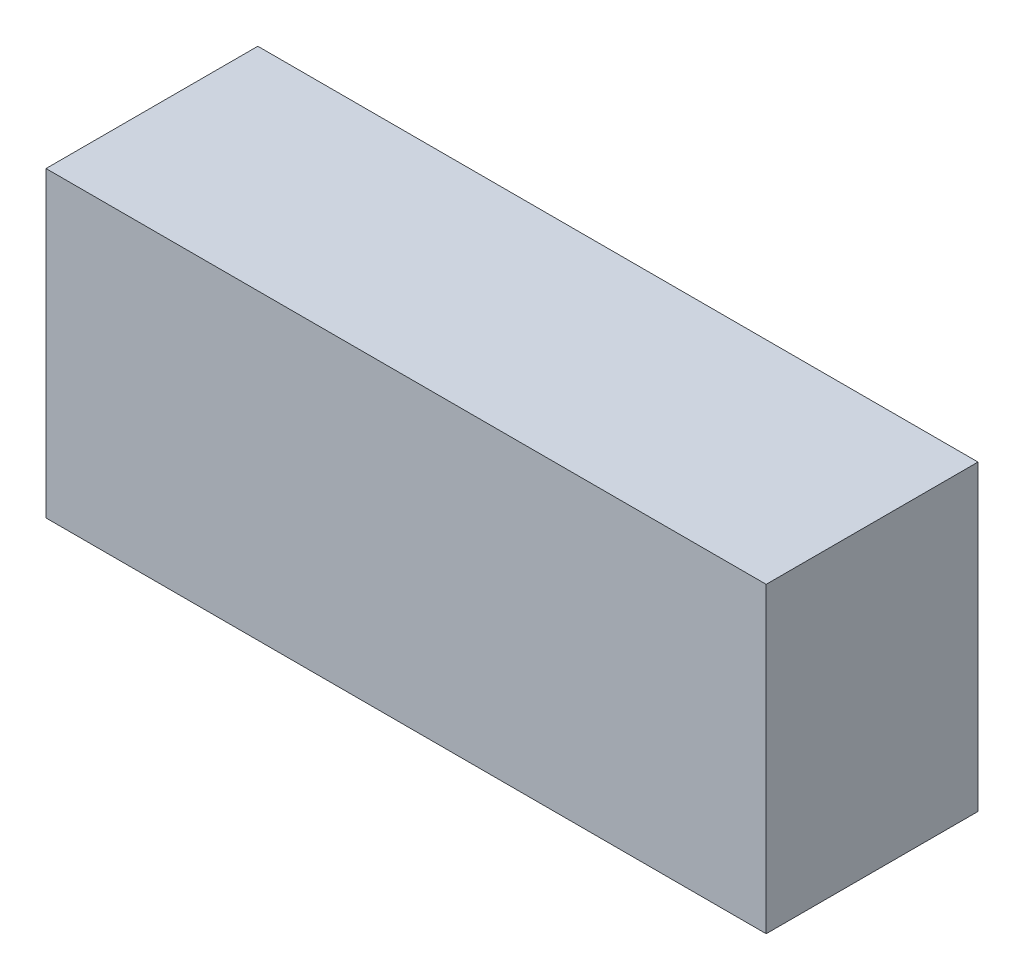
ISO-10303-21;
HEADER;
FILE_DESCRIPTION(('STEP AP214'),'2;1');
FILE_NAME('part.step','',(''),(''),'','','');
FILE_SCHEMA(('AUTOMOTIVE_DESIGN { 1 0 10303 214 1 1 1 1 }'));
ENDSEC;
DATA;
#1=APPLICATION_CONTEXT('core data for automotive mechanical design processes');
#2=APPLICATION_PROTOCOL_DEFINITION('international standard','automotive_design',2000,#1);
#3=PRODUCT_CONTEXT('',#1,'mechanical');
#4=PRODUCT('Part','Part','',(#3));
#5=PRODUCT_RELATED_PRODUCT_CATEGORY('part','',(#4));
#6=PRODUCT_DEFINITION_FORMATION('','',#4);
#7=PRODUCT_DEFINITION_CONTEXT('part definition',#1,'design');
#8=PRODUCT_DEFINITION('design','',#6,#7);
#9=PRODUCT_DEFINITION_SHAPE('','',#8);
#10=(LENGTH_UNIT() NAMED_UNIT(*) SI_UNIT(.MILLI.,.METRE.));
#11=(NAMED_UNIT(*) PLANE_ANGLE_UNIT() SI_UNIT($,.RADIAN.));
#12=(NAMED_UNIT(*) SI_UNIT($,.STERADIAN.) SOLID_ANGLE_UNIT());
#13=UNCERTAINTY_MEASURE_WITH_UNIT(LENGTH_MEASURE(1.E-05),#10,'distance_accuracy_value','');
#14=(GEOMETRIC_REPRESENTATION_CONTEXT(3) GLOBAL_UNCERTAINTY_ASSIGNED_CONTEXT((#13)) GLOBAL_UNIT_ASSIGNED_CONTEXT((#10,
#11,#12)) REPRESENTATION_CONTEXT('',''));
#15=CARTESIAN_POINT('',(0.,0.,0.));
#16=DIRECTION('',(0.,0.,1.));
#17=DIRECTION('',(1.,0.,0.));
#18=AXIS2_PLACEMENT_3D('',#15,#16,#17);
#19=CARTESIAN_POINT('',(-2.71999964,-1.143,1.59999934));
#20=DIRECTION('',(0.,0.,-1.));
#21=DIRECTION('',(-1.,0.,0.));
#22=AXIS2_PLACEMENT_3D('',#19,#20,#21);
#23=PLANE('',#22);
#24=DIRECTION('',(0.,1.,0.));
#25=VECTOR('',#24,1.);
#26=CARTESIAN_POINT('',(2.71999964,-1.143,1.59999934));
#27=LINE('',#26,#25);
#28=CARTESIAN_POINT('',(2.71999964,-1.143,1.59999934));
#29=VERTEX_POINT('',#28);
#30=CARTESIAN_POINT('',(2.71999964,1.143,1.59999934));
#31=VERTEX_POINT('',#30);
#32=EDGE_CURVE('E63',#29,#31,#27,.T.);
#33=ORIENTED_EDGE('',*,*,#32,.T.);
#34=DIRECTION('',(1.,0.,0.));
#35=VECTOR('',#34,1.);
#36=CARTESIAN_POINT('',(2.71999964,1.143,1.59999934));
#37=LINE('',#36,#35);
#38=CARTESIAN_POINT('',(-2.71999964,1.143,1.59999934));
#39=VERTEX_POINT('',#38);
#40=EDGE_CURVE('E65',#31,#39,#37,.F.);
#41=ORIENTED_EDGE('',*,*,#40,.T.);
#42=DIRECTION('',(0.,1.,0.));
#43=VECTOR('',#42,1.);
#44=CARTESIAN_POINT('',(-2.71999964,1.143,1.59999934));
#45=LINE('',#44,#43);
#46=CARTESIAN_POINT('',(-2.71999964,-1.143,1.59999934));
#47=VERTEX_POINT('',#46);
#48=EDGE_CURVE('E20',#39,#47,#45,.F.);
#49=ORIENTED_EDGE('',*,*,#48,.T.);
#50=DIRECTION('',(1.,0.,0.));
#51=VECTOR('',#50,1.);
#52=CARTESIAN_POINT('',(-2.71999964,-1.143,1.59999934));
#53=LINE('',#52,#51);
#54=EDGE_CURVE('E95',#47,#29,#53,.T.);
#55=ORIENTED_EDGE('',*,*,#54,.T.);
#56=EDGE_LOOP('',(#33,#41,#49,#55));
#57=FACE_BOUND('',#56,.T.);
#58=ADVANCED_FACE('F17',(#57),#23,.F.);
#59=CARTESIAN_POINT('',(-2.71999964,1.143,0.));
#60=DIRECTION('',(1.,0.,0.));
#61=DIRECTION('',(0.,0.,-1.));
#62=AXIS2_PLACEMENT_3D('',#59,#60,#61);
#63=PLANE('',#62);
#64=DIRECTION('',(0.,0.,1.));
#65=VECTOR('',#64,1.);
#66=CARTESIAN_POINT('',(-2.71999964,-1.143,0.));
#67=LINE('',#66,#65);
#68=CARTESIAN_POINT('',(-2.71999964,-1.143,0.));
#69=VERTEX_POINT('',#68);
#70=EDGE_CURVE('E77',#69,#47,#67,.T.);
#71=ORIENTED_EDGE('',*,*,#70,.T.);
#72=ORIENTED_EDGE('',*,*,#48,.F.);
#73=DIRECTION('',(0.,0.,-1.));
#74=VECTOR('',#73,1.);
#75=CARTESIAN_POINT('',(-2.71999964,1.143,0.));
#76=LINE('',#75,#74);
#77=CARTESIAN_POINT('',(-2.71999964,1.143,0.));
#78=VERTEX_POINT('',#77);
#79=EDGE_CURVE('E72',#39,#78,#76,.T.);
#80=ORIENTED_EDGE('',*,*,#79,.T.);
#81=DIRECTION('',(0.,1.,0.));
#82=VECTOR('',#81,1.);
#83=CARTESIAN_POINT('',(-2.71999964,-1.143,0.));
#84=LINE('',#83,#82);
#85=EDGE_CURVE('E99',#69,#78,#84,.T.);
#86=ORIENTED_EDGE('',*,*,#85,.F.);
#87=EDGE_LOOP('',(#71,#72,#80,#86));
#88=FACE_BOUND('',#87,.T.);
#89=ADVANCED_FACE('F74',(#88),#63,.F.);
#90=CARTESIAN_POINT('',(2.71999964,1.143,0.));
#91=DIRECTION('',(0.,-1.,0.));
#92=DIRECTION('',(0.,0.,-1.));
#93=AXIS2_PLACEMENT_3D('',#90,#91,#92);
#94=PLANE('',#93);
#95=ORIENTED_EDGE('',*,*,#79,.F.);
#96=ORIENTED_EDGE('',*,*,#40,.F.);
#97=DIRECTION('',(0.,0.,1.));
#98=VECTOR('',#97,1.);
#99=CARTESIAN_POINT('',(2.71999964,1.143,0.));
#100=LINE('',#99,#98);
#101=CARTESIAN_POINT('',(2.71999964,1.143,0.));
#102=VERTEX_POINT('',#101);
#103=EDGE_CURVE('E88',#31,#102,#100,.F.);
#104=ORIENTED_EDGE('',*,*,#103,.T.);
#105=DIRECTION('',(-1.,0.,0.));
#106=VECTOR('',#105,1.);
#107=CARTESIAN_POINT('',(-2.71999964,1.143,0.));
#108=LINE('',#107,#106);
#109=EDGE_CURVE('E81',#78,#102,#108,.F.);
#110=ORIENTED_EDGE('',*,*,#109,.F.);
#111=EDGE_LOOP('',(#95,#96,#104,#110));
#112=FACE_BOUND('',#111,.T.);
#113=ADVANCED_FACE('F79',(#112),#94,.F.);
#114=CARTESIAN_POINT('',(2.71999964,-1.143,0.));
#115=DIRECTION('',(-1.,0.,0.));
#116=DIRECTION('',(0.,0.,1.));
#117=AXIS2_PLACEMENT_3D('',#114,#115,#116);
#118=PLANE('',#117);
#119=ORIENTED_EDGE('',*,*,#103,.F.);
#120=ORIENTED_EDGE('',*,*,#32,.F.);
#121=DIRECTION('',(0.,0.,1.));
#122=VECTOR('',#121,1.);
#123=CARTESIAN_POINT('',(2.71999964,-1.143,0.));
#124=LINE('',#123,#122);
#125=CARTESIAN_POINT('',(2.71999964,-1.143,0.));
#126=VERTEX_POINT('',#125);
#127=EDGE_CURVE('E40',#29,#126,#124,.F.);
#128=ORIENTED_EDGE('',*,*,#127,.T.);
#129=DIRECTION('',(0.,1.,0.));
#130=VECTOR('',#129,1.);
#131=CARTESIAN_POINT('',(2.71999964,-1.143,0.));
#132=LINE('',#131,#130);
#133=EDGE_CURVE('E27',#102,#126,#132,.F.);
#134=ORIENTED_EDGE('',*,*,#133,.F.);
#135=EDGE_LOOP('',(#119,#120,#128,#134));
#136=FACE_BOUND('',#135,.T.);
#137=ADVANCED_FACE('F108',(#136),#118,.F.);
#138=CARTESIAN_POINT('',(-2.71999964,-1.143,0.));
#139=DIRECTION('',(0.,1.,0.));
#140=DIRECTION('',(0.,0.,1.));
#141=AXIS2_PLACEMENT_3D('',#138,#139,#140);
#142=PLANE('',#141);
#143=ORIENTED_EDGE('',*,*,#127,.F.);
#144=ORIENTED_EDGE('',*,*,#54,.F.);
#145=ORIENTED_EDGE('',*,*,#70,.F.);
#146=DIRECTION('',(-1.,0.,0.));
#147=VECTOR('',#146,1.);
#148=CARTESIAN_POINT('',(-2.71999964,-1.143,0.));
#149=LINE('',#148,#147);
#150=EDGE_CURVE('E11',#126,#69,#149,.T.);
#151=ORIENTED_EDGE('',*,*,#150,.F.);
#152=EDGE_LOOP('',(#143,#144,#145,#151));
#153=FACE_BOUND('',#152,.T.);
#154=ADVANCED_FACE('F110',(#153),#142,.F.);
#155=CARTESIAN_POINT('',(-2.71999964,-1.143,0.));
#156=DIRECTION('',(0.,0.,-1.));
#157=DIRECTION('',(-1.,0.,0.));
#158=AXIS2_PLACEMENT_3D('',#155,#156,#157);
#159=PLANE('',#158);
#160=ORIENTED_EDGE('',*,*,#133,.T.);
#161=ORIENTED_EDGE('',*,*,#150,.T.);
#162=ORIENTED_EDGE('',*,*,#85,.T.);
#163=ORIENTED_EDGE('',*,*,#109,.T.);
#164=EDGE_LOOP('',(#160,#161,#162,#163));
#165=FACE_BOUND('',#164,.T.);
#166=ADVANCED_FACE('F107',(#165),#159,.T.);
#167=CLOSED_SHELL('',(#58,#89,#113,#137,#154,#166));
#168=MANIFOLD_SOLID_BREP('B1',#167);
#169=ADVANCED_BREP_SHAPE_REPRESENTATION('',(#18,#168),#14);
#170=SHAPE_DEFINITION_REPRESENTATION(#9,#169);
ENDSEC;
END-ISO-10303-21;
